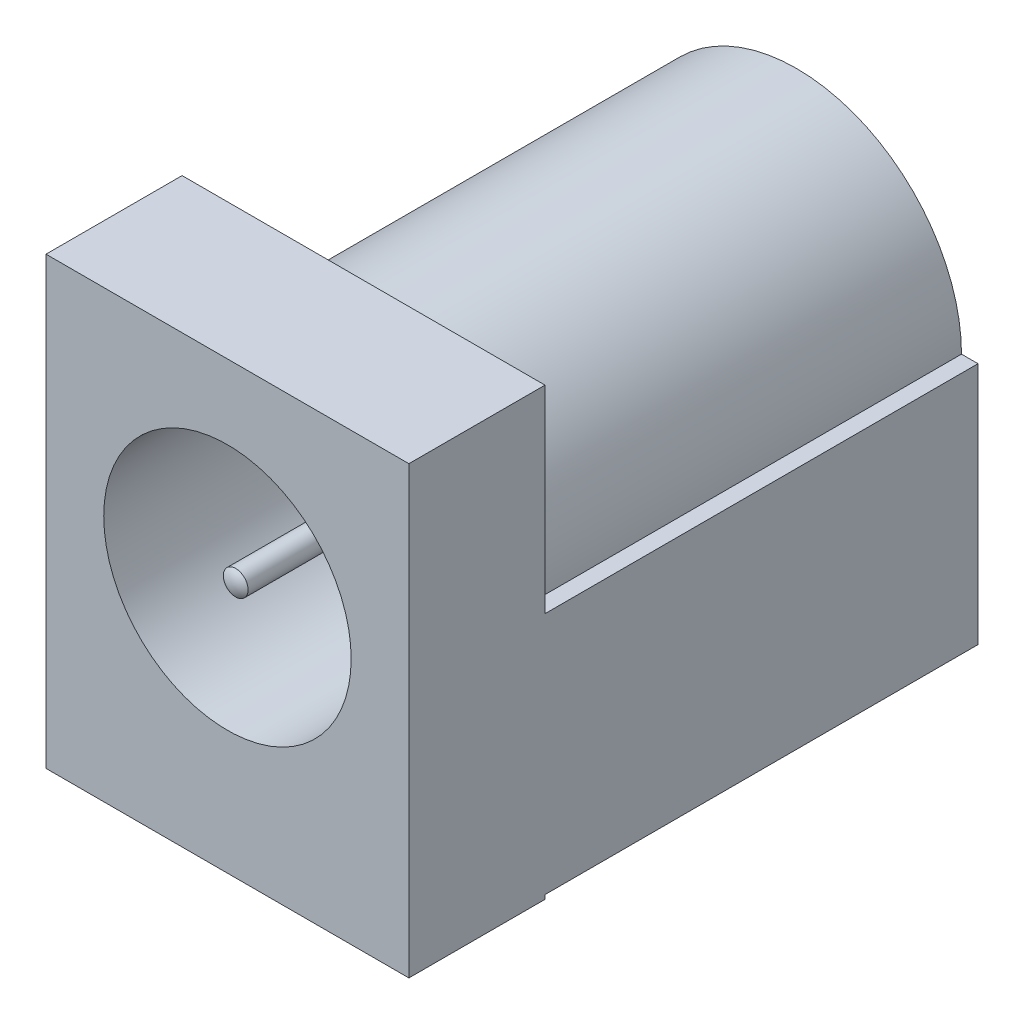
ISO-10303-21;
HEADER;
FILE_DESCRIPTION(('STEP AP214'),'2;1');
FILE_NAME('part.step','',(''),(''),'','','');
FILE_SCHEMA(('AUTOMOTIVE_DESIGN { 1 0 10303 214 1 1 1 1 }'));
ENDSEC;
DATA;
#1=APPLICATION_CONTEXT('core data for automotive mechanical design processes');
#2=APPLICATION_PROTOCOL_DEFINITION('international standard','automotive_design',2000,#1);
#3=PRODUCT_CONTEXT('',#1,'mechanical');
#4=PRODUCT('Part','Part','',(#3));
#5=PRODUCT_RELATED_PRODUCT_CATEGORY('part','',(#4));
#6=PRODUCT_DEFINITION_FORMATION('','',#4);
#7=PRODUCT_DEFINITION_CONTEXT('part definition',#1,'design');
#8=PRODUCT_DEFINITION('design','',#6,#7);
#9=PRODUCT_DEFINITION_SHAPE('','',#8);
#10=(LENGTH_UNIT() NAMED_UNIT(*) SI_UNIT(.MILLI.,.METRE.));
#11=(NAMED_UNIT(*) PLANE_ANGLE_UNIT() SI_UNIT($,.RADIAN.));
#12=(NAMED_UNIT(*) SI_UNIT($,.STERADIAN.) SOLID_ANGLE_UNIT());
#13=UNCERTAINTY_MEASURE_WITH_UNIT(LENGTH_MEASURE(1.E-05),#10,'distance_accuracy_value','');
#14=(GEOMETRIC_REPRESENTATION_CONTEXT(3) GLOBAL_UNCERTAINTY_ASSIGNED_CONTEXT((#13)) GLOBAL_UNIT_ASSIGNED_CONTEXT((#10,
#11,#12)) REPRESENTATION_CONTEXT('',''));
#15=CARTESIAN_POINT('',(0.,0.,0.));
#16=DIRECTION('',(0.,0.,1.));
#17=DIRECTION('',(1.,0.,0.));
#18=AXIS2_PLACEMENT_3D('',#15,#16,#17);
#19=CARTESIAN_POINT('',(0.,0.,10.5));
#20=DIRECTION('',(0.,0.,1.));
#21=DIRECTION('',(1.,0.,0.));
#22=AXIS2_PLACEMENT_3D('',#19,#20,#21);
#23=PLANE('',#22);
#24=DIRECTION('',(0.,-1.,0.));
#25=VECTOR('',#24,1.);
#26=CARTESIAN_POINT('',(-4.4,4.8,10.5));
#27=LINE('',#26,#25);
#28=CARTESIAN_POINT('',(-4.4,-5.9,10.5));
#29=VERTEX_POINT('',#28);
#30=CARTESIAN_POINT('',(-4.4,-6.,10.5));
#31=VERTEX_POINT('',#30);
#32=EDGE_CURVE('E172',#29,#31,#27,.T.);
#33=ORIENTED_EDGE('',*,*,#32,.F.);
#34=DIRECTION('',(1.,0.,0.));
#35=VECTOR('',#34,1.);
#36=CARTESIAN_POINT('',(-4.4,-5.9,10.5));
#37=LINE('',#36,#35);
#38=CARTESIAN_POINT('',(4.4,-5.9,10.5));
#39=VERTEX_POINT('',#38);
#40=EDGE_CURVE('E164',#29,#39,#37,.T.);
#41=ORIENTED_EDGE('',*,*,#40,.T.);
#42=DIRECTION('',(0.,1.,0.));
#43=VECTOR('',#42,1.);
#44=CARTESIAN_POINT('',(4.4,4.8,10.5));
#45=LINE('',#44,#43);
#46=CARTESIAN_POINT('',(4.4,-6.,10.5));
#47=VERTEX_POINT('',#46);
#48=EDGE_CURVE('E184',#47,#39,#45,.T.);
#49=ORIENTED_EDGE('',*,*,#48,.F.);
#50=DIRECTION('',(1.,0.,0.));
#51=VECTOR('',#50,1.);
#52=CARTESIAN_POINT('',(-4.4,-6.,10.5));
#53=LINE('',#52,#51);
#54=EDGE_CURVE('E181',#31,#47,#53,.T.);
#55=ORIENTED_EDGE('',*,*,#54,.F.);
#56=EDGE_LOOP('',(#33,#41,#49,#55));
#57=FACE_BOUND('',#56,.T.);
#58=ADVANCED_FACE('F34',(#57),#23,.F.);
#59=CARTESIAN_POINT('',(0.,0.,10.5));
#60=DIRECTION('',(0.,0.,-1.));
#61=DIRECTION('',(-1.,0.,0.));
#62=AXIS2_PLACEMENT_3D('',#59,#60,#61);
#63=CYLINDRICAL_SURFACE('',#62,4.);
#64=CARTESIAN_POINT('',(0.,0.,10.5));
#65=DIRECTION('',(0.,0.,1.));
#66=DIRECTION('',(1.,0.,0.));
#67=AXIS2_PLACEMENT_3D('',#64,#65,#66);
#68=CIRCLE('',#67,4.);
#69=CARTESIAN_POINT('',(4.,0.,10.5));
#70=VERTEX_POINT('',#69);
#71=CARTESIAN_POINT('',(-4.,0.,10.5));
#72=VERTEX_POINT('',#71);
#73=EDGE_CURVE('E43',#70,#72,#68,.T.);
#74=ORIENTED_EDGE('',*,*,#73,.F.);
#75=DIRECTION('',(0.,0.,-1.));
#76=VECTOR('',#75,1.);
#77=CARTESIAN_POINT('',(4.,0.,10.5));
#78=LINE('',#77,#76);
#79=CARTESIAN_POINT('',(4.,0.,0.));
#80=VERTEX_POINT('',#79);
#81=EDGE_CURVE('E169',#70,#80,#78,.T.);
#82=ORIENTED_EDGE('',*,*,#81,.T.);
#83=CARTESIAN_POINT('',(0.,0.,0.));
#84=DIRECTION('',(0.,0.,1.));
#85=DIRECTION('',(1.,0.,0.));
#86=AXIS2_PLACEMENT_3D('',#83,#84,#85);
#87=CIRCLE('',#86,4.);
#88=CARTESIAN_POINT('',(-4.,0.,0.));
#89=VERTEX_POINT('',#88);
#90=EDGE_CURVE('E196',#80,#89,#87,.T.);
#91=ORIENTED_EDGE('',*,*,#90,.T.);
#92=DIRECTION('',(0.,0.,-1.));
#93=VECTOR('',#92,1.);
#94=CARTESIAN_POINT('',(-4.,0.,10.5));
#95=LINE('',#94,#93);
#96=EDGE_CURVE('E128',#89,#72,#95,.F.);
#97=ORIENTED_EDGE('',*,*,#96,.T.);
#98=EDGE_LOOP('',(#74,#82,#91,#97));
#99=FACE_BOUND('',#98,.T.);
#100=ADVANCED_FACE('F201',(#99),#63,.T.);
#101=CARTESIAN_POINT('',(0.,0.,0.));
#102=DIRECTION('',(0.,0.,1.));
#103=DIRECTION('',(1.,0.,0.));
#104=AXIS2_PLACEMENT_3D('',#101,#102,#103);
#105=PLANE('',#104);
#106=ORIENTED_EDGE('',*,*,#90,.F.);
#107=DIRECTION('',(1.,0.,0.));
#108=VECTOR('',#107,1.);
#109=CARTESIAN_POINT('',(-4.4,0.,0.));
#110=LINE('',#109,#108);
#111=CARTESIAN_POINT('',(4.4,0.,0.));
#112=VERTEX_POINT('',#111);
#113=EDGE_CURVE('E134',#80,#112,#110,.T.);
#114=ORIENTED_EDGE('',*,*,#113,.T.);
#115=DIRECTION('',(0.,1.,0.));
#116=VECTOR('',#115,1.);
#117=CARTESIAN_POINT('',(4.4,0.,0.));
#118=LINE('',#117,#116);
#119=CARTESIAN_POINT('',(4.4,-5.9,0.));
#120=VERTEX_POINT('',#119);
#121=EDGE_CURVE('E159',#120,#112,#118,.T.);
#122=ORIENTED_EDGE('',*,*,#121,.F.);
#123=DIRECTION('',(1.,0.,0.));
#124=VECTOR('',#123,1.);
#125=CARTESIAN_POINT('',(-4.4,-5.9,0.));
#126=LINE('',#125,#124);
#127=CARTESIAN_POINT('',(-4.4,-5.9,0.));
#128=VERTEX_POINT('',#127);
#129=EDGE_CURVE('E149',#128,#120,#126,.T.);
#130=ORIENTED_EDGE('',*,*,#129,.F.);
#131=DIRECTION('',(0.,1.,0.));
#132=VECTOR('',#131,1.);
#133=CARTESIAN_POINT('',(-4.4,0.,0.));
#134=LINE('',#133,#132);
#135=CARTESIAN_POINT('',(-4.4,0.,0.));
#136=VERTEX_POINT('',#135);
#137=EDGE_CURVE('E141',#128,#136,#134,.T.);
#138=ORIENTED_EDGE('',*,*,#137,.T.);
#139=EDGE_CURVE('E122',#136,#89,#110,.T.);
#140=ORIENTED_EDGE('',*,*,#139,.T.);
#141=EDGE_LOOP('',(#106,#114,#122,#130,#138,#140));
#142=FACE_BOUND('',#141,.T.);
#143=ADVANCED_FACE('F147',(#142),#105,.F.);
#144=CARTESIAN_POINT('',(-4.4,4.8,13.8));
#145=DIRECTION('',(1.,0.,0.));
#146=DIRECTION('',(0.,1.,0.));
#147=AXIS2_PLACEMENT_3D('',#144,#145,#146);
#148=PLANE('',#147);
#149=CARTESIAN_POINT('',(-4.4,4.8,10.5));
#150=VERTEX_POINT('',#149);
#151=CARTESIAN_POINT('',(-4.4,0.,10.5));
#152=VERTEX_POINT('',#151);
#153=EDGE_CURVE('E144',#150,#152,#27,.T.);
#154=ORIENTED_EDGE('',*,*,#153,.T.);
#155=DIRECTION('',(0.,0.,1.));
#156=VECTOR('',#155,1.);
#157=CARTESIAN_POINT('',(-4.4,0.,0.));
#158=LINE('',#157,#156);
#159=EDGE_CURVE('E125',#136,#152,#158,.T.);
#160=ORIENTED_EDGE('',*,*,#159,.F.);
#161=ORIENTED_EDGE('',*,*,#137,.F.);
#162=DIRECTION('',(0.,0.,-1.));
#163=VECTOR('',#162,1.);
#164=CARTESIAN_POINT('',(-4.4,-5.9,0.));
#165=LINE('',#164,#163);
#166=EDGE_CURVE('E145',#29,#128,#165,.T.);
#167=ORIENTED_EDGE('',*,*,#166,.F.);
#168=ORIENTED_EDGE('',*,*,#32,.T.);
#169=DIRECTION('',(0.,0.,-1.));
#170=VECTOR('',#169,1.);
#171=CARTESIAN_POINT('',(-4.4,-6.,13.8));
#172=LINE('',#171,#170);
#173=CARTESIAN_POINT('',(-4.4,-6.,13.8));
#174=VERTEX_POINT('',#173);
#175=EDGE_CURVE('E194',#174,#31,#172,.T.);
#176=ORIENTED_EDGE('',*,*,#175,.F.);
#177=DIRECTION('',(0.,-1.,0.));
#178=VECTOR('',#177,1.);
#179=CARTESIAN_POINT('',(-4.4,4.8,13.8));
#180=LINE('',#179,#178);
#181=CARTESIAN_POINT('',(-4.4,4.8,13.8));
#182=VERTEX_POINT('',#181);
#183=EDGE_CURVE('E173',#182,#174,#180,.T.);
#184=ORIENTED_EDGE('',*,*,#183,.F.);
#185=DIRECTION('',(0.,0.,-1.));
#186=VECTOR('',#185,1.);
#187=CARTESIAN_POINT('',(-4.4,4.8,13.8));
#188=LINE('',#187,#186);
#189=EDGE_CURVE('E179',#182,#150,#188,.T.);
#190=ORIENTED_EDGE('',*,*,#189,.T.);
#191=EDGE_LOOP('',(#154,#160,#161,#167,#168,#176,#184,#190));
#192=FACE_BOUND('',#191,.T.);
#193=ADVANCED_FACE('F139',(#192),#148,.F.);
#194=CARTESIAN_POINT('',(-4.4,-6.,13.8));
#195=DIRECTION('',(0.,1.,0.));
#196=DIRECTION('',(-1.,0.,0.));
#197=AXIS2_PLACEMENT_3D('',#194,#195,#196);
#198=PLANE('',#197);
#199=ORIENTED_EDGE('',*,*,#54,.T.);
#200=DIRECTION('',(0.,0.,-1.));
#201=VECTOR('',#200,1.);
#202=CARTESIAN_POINT('',(4.4,-6.,13.8));
#203=LINE('',#202,#201);
#204=CARTESIAN_POINT('',(4.4,-6.,13.8));
#205=VERTEX_POINT('',#204);
#206=EDGE_CURVE('E191',#205,#47,#203,.T.);
#207=ORIENTED_EDGE('',*,*,#206,.F.);
#208=DIRECTION('',(1.,0.,0.));
#209=VECTOR('',#208,1.);
#210=CARTESIAN_POINT('',(-4.4,-6.,13.8));
#211=LINE('',#210,#209);
#212=EDGE_CURVE('E87',#174,#205,#211,.T.);
#213=ORIENTED_EDGE('',*,*,#212,.F.);
#214=ORIENTED_EDGE('',*,*,#175,.T.);
#215=EDGE_LOOP('',(#199,#207,#213,#214));
#216=FACE_BOUND('',#215,.T.);
#217=ADVANCED_FACE('F214',(#216),#198,.F.);
#218=CARTESIAN_POINT('',(4.4,4.8,13.8));
#219=DIRECTION('',(-1.,0.,0.));
#220=DIRECTION('',(0.,-1.,0.));
#221=AXIS2_PLACEMENT_3D('',#218,#219,#220);
#222=PLANE('',#221);
#223=ORIENTED_EDGE('',*,*,#48,.T.);
#224=DIRECTION('',(0.,0.,-1.));
#225=VECTOR('',#224,1.);
#226=CARTESIAN_POINT('',(4.4,-5.9,0.));
#227=LINE('',#226,#225);
#228=EDGE_CURVE('E150',#39,#120,#227,.T.);
#229=ORIENTED_EDGE('',*,*,#228,.T.);
#230=ORIENTED_EDGE('',*,*,#121,.T.);
#231=DIRECTION('',(0.,0.,1.));
#232=VECTOR('',#231,1.);
#233=CARTESIAN_POINT('',(4.4,0.,0.));
#234=LINE('',#233,#232);
#235=CARTESIAN_POINT('',(4.4,0.,10.5));
#236=VERTEX_POINT('',#235);
#237=EDGE_CURVE('E50',#112,#236,#234,.T.);
#238=ORIENTED_EDGE('',*,*,#237,.T.);
#239=CARTESIAN_POINT('',(4.4,4.8,10.5));
#240=VERTEX_POINT('',#239);
#241=EDGE_CURVE('E183',#236,#240,#45,.T.);
#242=ORIENTED_EDGE('',*,*,#241,.T.);
#243=DIRECTION('',(0.,0.,-1.));
#244=VECTOR('',#243,1.);
#245=CARTESIAN_POINT('',(4.4,4.8,13.8));
#246=LINE('',#245,#244);
#247=CARTESIAN_POINT('',(4.4,4.8,13.8));
#248=VERTEX_POINT('',#247);
#249=EDGE_CURVE('E189',#248,#240,#246,.T.);
#250=ORIENTED_EDGE('',*,*,#249,.F.);
#251=DIRECTION('',(0.,1.,0.));
#252=VECTOR('',#251,1.);
#253=CARTESIAN_POINT('',(4.4,4.8,13.8));
#254=LINE('',#253,#252);
#255=EDGE_CURVE('E176',#205,#248,#254,.T.);
#256=ORIENTED_EDGE('',*,*,#255,.F.);
#257=ORIENTED_EDGE('',*,*,#206,.T.);
#258=EDGE_LOOP('',(#223,#229,#230,#238,#242,#250,#256,#257));
#259=FACE_BOUND('',#258,.T.);
#260=ADVANCED_FACE('F205',(#259),#222,.F.);
#261=CARTESIAN_POINT('',(-4.4,4.8,13.8));
#262=DIRECTION('',(0.,-1.,0.));
#263=DIRECTION('',(1.,0.,0.));
#264=AXIS2_PLACEMENT_3D('',#261,#262,#263);
#265=PLANE('',#264);
#266=DIRECTION('',(-1.,0.,0.));
#267=VECTOR('',#266,1.);
#268=CARTESIAN_POINT('',(-4.4,4.8,10.5));
#269=LINE('',#268,#267);
#270=EDGE_CURVE('E79',#240,#150,#269,.T.);
#271=ORIENTED_EDGE('',*,*,#270,.T.);
#272=ORIENTED_EDGE('',*,*,#189,.F.);
#273=DIRECTION('',(-1.,0.,0.));
#274=VECTOR('',#273,1.);
#275=CARTESIAN_POINT('',(-4.4,4.8,13.8));
#276=LINE('',#275,#274);
#277=EDGE_CURVE('E59',#248,#182,#276,.T.);
#278=ORIENTED_EDGE('',*,*,#277,.F.);
#279=ORIENTED_EDGE('',*,*,#249,.T.);
#280=EDGE_LOOP('',(#271,#272,#278,#279));
#281=FACE_BOUND('',#280,.T.);
#282=ADVANCED_FACE('F220',(#281),#265,.F.);
#283=CARTESIAN_POINT('',(0.,0.,13.8));
#284=DIRECTION('',(0.,0.,1.));
#285=DIRECTION('',(1.,0.,0.));
#286=AXIS2_PLACEMENT_3D('',#283,#284,#285);
#287=PLANE('',#286);
#288=CARTESIAN_POINT('',(0.,0.,13.8));
#289=DIRECTION('',(0.,0.,1.));
#290=DIRECTION('',(1.,0.,0.));
#291=AXIS2_PLACEMENT_3D('',#288,#289,#290);
#292=CIRCLE('',#291,3.);
#293=CARTESIAN_POINT('',(3.,0.,13.8));
#294=VERTEX_POINT('',#293);
#295=EDGE_CURVE('E155',#294,#294,#292,.T.);
#296=ORIENTED_EDGE('',*,*,#295,.F.);
#297=EDGE_LOOP('',(#296));
#298=FACE_BOUND('',#297,.T.);
#299=ORIENTED_EDGE('',*,*,#183,.T.);
#300=ORIENTED_EDGE('',*,*,#212,.T.);
#301=ORIENTED_EDGE('',*,*,#255,.T.);
#302=ORIENTED_EDGE('',*,*,#277,.T.);
#303=EDGE_LOOP('',(#299,#300,#301,#302));
#304=FACE_BOUND('',#303,.T.);
#305=ADVANCED_FACE('F217',(#298,#304),#287,.T.);
#306=ORIENTED_EDGE('',*,*,#241,.F.);
#307=DIRECTION('',(-1.,0.,0.));
#308=VECTOR('',#307,1.);
#309=CARTESIAN_POINT('',(0.,0.,10.5));
#310=LINE('',#309,#308);
#311=EDGE_CURVE('E11',#236,#70,#310,.T.);
#312=ORIENTED_EDGE('',*,*,#311,.T.);
#313=ORIENTED_EDGE('',*,*,#73,.T.);
#314=DIRECTION('',(1.,0.,0.));
#315=VECTOR('',#314,1.);
#316=CARTESIAN_POINT('',(-4.4,0.,10.5));
#317=LINE('',#316,#315);
#318=EDGE_CURVE('E133',#152,#72,#317,.T.);
#319=ORIENTED_EDGE('',*,*,#318,.F.);
#320=ORIENTED_EDGE('',*,*,#153,.F.);
#321=ORIENTED_EDGE('',*,*,#270,.F.);
#322=EDGE_LOOP('',(#306,#312,#313,#319,#320,#321));
#323=FACE_BOUND('',#322,.T.);
#324=ADVANCED_FACE('F219',(#323),#23,.F.);
#325=CARTESIAN_POINT('',(-4.4,0.,0.));
#326=DIRECTION('',(0.,1.,0.));
#327=DIRECTION('',(-1.,0.,0.));
#328=AXIS2_PLACEMENT_3D('',#325,#326,#327);
#329=PLANE('',#328);
#330=ORIENTED_EDGE('',*,*,#81,.F.);
#331=ORIENTED_EDGE('',*,*,#311,.F.);
#332=ORIENTED_EDGE('',*,*,#237,.F.);
#333=ORIENTED_EDGE('',*,*,#113,.F.);
#334=EDGE_LOOP('',(#330,#331,#332,#333));
#335=FACE_BOUND('',#334,.T.);
#336=ADVANCED_FACE('F203',(#335),#329,.T.);
#337=ORIENTED_EDGE('',*,*,#96,.F.);
#338=ORIENTED_EDGE('',*,*,#139,.F.);
#339=ORIENTED_EDGE('',*,*,#159,.T.);
#340=ORIENTED_EDGE('',*,*,#318,.T.);
#341=EDGE_LOOP('',(#337,#338,#339,#340));
#342=FACE_BOUND('',#341,.T.);
#343=ADVANCED_FACE('F124',(#342),#329,.T.);
#344=CARTESIAN_POINT('',(-4.4,-5.9,0.));
#345=DIRECTION('',(0.,-1.,0.));
#346=DIRECTION('',(1.,0.,0.));
#347=AXIS2_PLACEMENT_3D('',#344,#345,#346);
#348=PLANE('',#347);
#349=ORIENTED_EDGE('',*,*,#228,.F.);
#350=ORIENTED_EDGE('',*,*,#40,.F.);
#351=ORIENTED_EDGE('',*,*,#166,.T.);
#352=ORIENTED_EDGE('',*,*,#129,.T.);
#353=EDGE_LOOP('',(#349,#350,#351,#352));
#354=FACE_BOUND('',#353,.T.);
#355=ADVANCED_FACE('F208',(#354),#348,.T.);
#356=CARTESIAN_POINT('',(0.,0.,1.8));
#357=DIRECTION('',(0.,0.,1.));
#358=DIRECTION('',(1.,0.,0.));
#359=AXIS2_PLACEMENT_3D('',#356,#357,#358);
#360=CYLINDRICAL_SURFACE('',#359,3.);
#361=CARTESIAN_POINT('',(0.,0.,1.8));
#362=DIRECTION('',(0.,0.,1.));
#363=DIRECTION('',(1.,0.,0.));
#364=AXIS2_PLACEMENT_3D('',#361,#362,#363);
#365=CIRCLE('',#364,3.);
#366=CARTESIAN_POINT('',(3.,0.,1.8));
#367=VERTEX_POINT('',#366);
#368=EDGE_CURVE('E161',#367,#367,#365,.T.);
#369=ORIENTED_EDGE('',*,*,#368,.F.);
#370=EDGE_LOOP('',(#369));
#371=FACE_BOUND('',#370,.T.);
#372=ORIENTED_EDGE('',*,*,#295,.T.);
#373=EDGE_LOOP('',(#372));
#374=FACE_BOUND('',#373,.T.);
#375=ADVANCED_FACE('F314',(#371,#374),#360,.F.);
#376=CARTESIAN_POINT('',(0.,0.,1.8));
#377=DIRECTION('',(0.,0.,1.));
#378=DIRECTION('',(1.,0.,0.));
#379=AXIS2_PLACEMENT_3D('',#376,#377,#378);
#380=PLANE('',#379);
#381=CARTESIAN_POINT('',(0.,0.,1.8));
#382=DIRECTION('',(0.,0.,1.));
#383=DIRECTION('',(1.,0.,0.));
#384=AXIS2_PLACEMENT_3D('',#381,#382,#383);
#385=CIRCLE('',#384,0.3);
#386=CARTESIAN_POINT('',(0.3,0.,1.8));
#387=VERTEX_POINT('',#386);
#388=EDGE_CURVE('E369',#387,#387,#385,.T.);
#389=ORIENTED_EDGE('',*,*,#388,.F.);
#390=EDGE_LOOP('',(#389));
#391=FACE_BOUND('',#390,.T.);
#392=ORIENTED_EDGE('',*,*,#368,.T.);
#393=EDGE_LOOP('',(#392));
#394=FACE_BOUND('',#393,.T.);
#395=ADVANCED_FACE('F322',(#391,#394),#380,.T.);
#396=CARTESIAN_POINT('',(0.,0.,13.6));
#397=DIRECTION('',(0.,0.,-1.));
#398=DIRECTION('',(-1.,0.,0.));
#399=AXIS2_PLACEMENT_3D('',#396,#397,#398);
#400=CYLINDRICAL_SURFACE('',#399,0.3);
#401=CARTESIAN_POINT('',(0.,0.,13.6));
#402=DIRECTION('',(0.,0.,1.));
#403=DIRECTION('',(1.,0.,0.));
#404=AXIS2_PLACEMENT_3D('',#401,#402,#403);
#405=CIRCLE('',#404,0.3);
#406=CARTESIAN_POINT('',(0.3,0.,13.6));
#407=VERTEX_POINT('',#406);
#408=EDGE_CURVE('E38',#407,#407,#405,.T.);
#409=ORIENTED_EDGE('',*,*,#408,.F.);
#410=EDGE_LOOP('',(#409));
#411=FACE_BOUND('',#410,.T.);
#412=ORIENTED_EDGE('',*,*,#388,.T.);
#413=EDGE_LOOP('',(#412));
#414=FACE_BOUND('',#413,.T.);
#415=ADVANCED_FACE('F331',(#411,#414),#400,.T.);
#416=CARTESIAN_POINT('',(0.,0.,13.2));
#417=DIRECTION('',(0.,0.,1.));
#418=DIRECTION('',(1.,0.,0.));
#419=AXIS2_PLACEMENT_3D('',#416,#417,#418);
#420=SPHERICAL_SURFACE('',#419,0.500000000000002);
#421=ORIENTED_EDGE('',*,*,#408,.T.);
#422=EDGE_LOOP('',(#421));
#423=FACE_BOUND('',#422,.T.);
#424=ADVANCED_FACE('F36',(#423),#420,.T.);
#425=CLOSED_SHELL('',(#58,#100,#143,#193,#217,#260,#282,#305,#324,#336,#343,#355,#375,#395,#415,#424));
#426=MANIFOLD_SOLID_BREP('B2',#425);
#427=ADVANCED_BREP_SHAPE_REPRESENTATION('',(#18,#426),#14);
#428=SHAPE_DEFINITION_REPRESENTATION(#9,#427);
ENDSEC;
END-ISO-10303-21;
